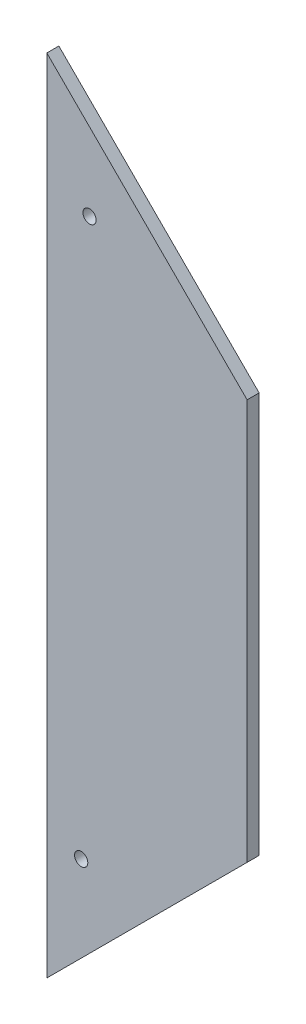
ISO-10303-21;
HEADER;
FILE_DESCRIPTION(('STEP AP214'),'2;1');
FILE_NAME('part.step','',(''),(''),'','','');
FILE_SCHEMA(('AUTOMOTIVE_DESIGN { 1 0 10303 214 1 1 1 1 }'));
ENDSEC;
DATA;
#1=APPLICATION_CONTEXT('core data for automotive mechanical design processes');
#2=APPLICATION_PROTOCOL_DEFINITION('international standard','automotive_design',2000,#1);
#3=PRODUCT_CONTEXT('',#1,'mechanical');
#4=PRODUCT('Part','Part','',(#3));
#5=PRODUCT_RELATED_PRODUCT_CATEGORY('part','',(#4));
#6=PRODUCT_DEFINITION_FORMATION('','',#4);
#7=PRODUCT_DEFINITION_CONTEXT('part definition',#1,'design');
#8=PRODUCT_DEFINITION('design','',#6,#7);
#9=PRODUCT_DEFINITION_SHAPE('','',#8);
#10=(LENGTH_UNIT() NAMED_UNIT(*) SI_UNIT(.MILLI.,.METRE.));
#11=(NAMED_UNIT(*) PLANE_ANGLE_UNIT() SI_UNIT($,.RADIAN.));
#12=(NAMED_UNIT(*) SI_UNIT($,.STERADIAN.) SOLID_ANGLE_UNIT());
#13=UNCERTAINTY_MEASURE_WITH_UNIT(LENGTH_MEASURE(1.E-05),#10,'distance_accuracy_value','');
#14=(GEOMETRIC_REPRESENTATION_CONTEXT(3) GLOBAL_UNCERTAINTY_ASSIGNED_CONTEXT((#13)) GLOBAL_UNIT_ASSIGNED_CONTEXT((#10,
#11,#12)) REPRESENTATION_CONTEXT('',''));
#15=CARTESIAN_POINT('',(0.,0.,0.));
#16=DIRECTION('',(0.,0.,1.));
#17=DIRECTION('',(1.,0.,0.));
#18=AXIS2_PLACEMENT_3D('',#15,#16,#17);
#19=CARTESIAN_POINT('',(0.,0.,3.));
#20=DIRECTION('',(-0.707106781186546,0.707106781186549,0.));
#21=DIRECTION('',(-0.707106781186549,-0.707106781186546,0.));
#22=AXIS2_PLACEMENT_3D('',#19,#20,#21);
#23=PLANE('',#22);
#24=DIRECTION('',(0.707106781186549,0.707106781186546,0.));
#25=VECTOR('',#24,1.);
#26=CARTESIAN_POINT('',(0.,0.,0.));
#27=LINE('',#26,#25);
#28=CARTESIAN_POINT('',(0.,0.,0.));
#29=VERTEX_POINT('',#28);
#30=CARTESIAN_POINT('',(50.,49.9999999999998,0.));
#31=VERTEX_POINT('',#30);
#32=EDGE_CURVE('E105',#29,#31,#27,.T.);
#33=ORIENTED_EDGE('',*,*,#32,.T.);
#34=DIRECTION('',(0.,0.,-1.));
#35=VECTOR('',#34,1.);
#36=CARTESIAN_POINT('',(50.,49.9999999999998,3.));
#37=LINE('',#36,#35);
#38=CARTESIAN_POINT('',(50.,49.9999999999998,3.));
#39=VERTEX_POINT('',#38);
#40=EDGE_CURVE('E11',#39,#31,#37,.T.);
#41=ORIENTED_EDGE('',*,*,#40,.F.);
#42=DIRECTION('',(0.707106781186549,0.707106781186546,0.));
#43=VECTOR('',#42,1.);
#44=CARTESIAN_POINT('',(0.,0.,3.));
#45=LINE('',#44,#43);
#46=CARTESIAN_POINT('',(0.,0.,3.));
#47=VERTEX_POINT('',#46);
#48=EDGE_CURVE('E92',#47,#39,#45,.T.);
#49=ORIENTED_EDGE('',*,*,#48,.F.);
#50=DIRECTION('',(0.,0.,-1.));
#51=VECTOR('',#50,1.);
#52=CARTESIAN_POINT('',(0.,0.,3.));
#53=LINE('',#52,#51);
#54=EDGE_CURVE('E101',#47,#29,#53,.T.);
#55=ORIENTED_EDGE('',*,*,#54,.T.);
#56=EDGE_LOOP('',(#33,#41,#49,#55));
#57=FACE_BOUND('',#56,.T.);
#58=ADVANCED_FACE('F39',(#57),#23,.F.);
#59=CARTESIAN_POINT('',(50.,49.9999999999998,3.));
#60=DIRECTION('',(-1.,0.,0.));
#61=DIRECTION('',(0.,0.,1.));
#62=AXIS2_PLACEMENT_3D('',#59,#60,#61);
#63=PLANE('',#62);
#64=DIRECTION('',(0.,1.,0.));
#65=VECTOR('',#64,1.);
#66=CARTESIAN_POINT('',(50.,49.9999999999998,0.));
#67=LINE('',#66,#65);
#68=CARTESIAN_POINT('',(50.,150.,0.));
#69=VERTEX_POINT('',#68);
#70=EDGE_CURVE('E96',#31,#69,#67,.T.);
#71=ORIENTED_EDGE('',*,*,#70,.T.);
#72=DIRECTION('',(0.,0.,-1.));
#73=VECTOR('',#72,1.);
#74=CARTESIAN_POINT('',(50.,150.,3.));
#75=LINE('',#74,#73);
#76=CARTESIAN_POINT('',(50.,150.,3.));
#77=VERTEX_POINT('',#76);
#78=EDGE_CURVE('E48',#77,#69,#75,.T.);
#79=ORIENTED_EDGE('',*,*,#78,.F.);
#80=DIRECTION('',(0.,1.,0.));
#81=VECTOR('',#80,1.);
#82=CARTESIAN_POINT('',(50.,49.9999999999998,3.));
#83=LINE('',#82,#81);
#84=EDGE_CURVE('E87',#39,#77,#83,.T.);
#85=ORIENTED_EDGE('',*,*,#84,.F.);
#86=ORIENTED_EDGE('',*,*,#40,.T.);
#87=EDGE_LOOP('',(#71,#79,#85,#86));
#88=FACE_BOUND('',#87,.T.);
#89=ADVANCED_FACE('F95',(#88),#63,.F.);
#90=CARTESIAN_POINT('',(50.,150.,3.));
#91=DIRECTION('',(-0.707106781186546,-0.707106781186549,0.));
#92=DIRECTION('',(0.707106781186549,-0.707106781186546,0.));
#93=AXIS2_PLACEMENT_3D('',#90,#91,#92);
#94=PLANE('',#93);
#95=DIRECTION('',(-0.707106781186549,0.707106781186546,0.));
#96=VECTOR('',#95,1.);
#97=CARTESIAN_POINT('',(50.,150.,0.));
#98=LINE('',#97,#96);
#99=CARTESIAN_POINT('',(0.,200.,0.));
#100=VERTEX_POINT('',#99);
#101=EDGE_CURVE('E74',#69,#100,#98,.T.);
#102=ORIENTED_EDGE('',*,*,#101,.T.);
#103=DIRECTION('',(0.,0.,-1.));
#104=VECTOR('',#103,1.);
#105=CARTESIAN_POINT('',(0.,200.,3.));
#106=LINE('',#105,#104);
#107=CARTESIAN_POINT('',(0.,200.,3.));
#108=VERTEX_POINT('',#107);
#109=EDGE_CURVE('E97',#108,#100,#106,.T.);
#110=ORIENTED_EDGE('',*,*,#109,.F.);
#111=DIRECTION('',(-0.707106781186549,0.707106781186546,0.));
#112=VECTOR('',#111,1.);
#113=CARTESIAN_POINT('',(50.,150.,3.));
#114=LINE('',#113,#112);
#115=EDGE_CURVE('E90',#77,#108,#114,.T.);
#116=ORIENTED_EDGE('',*,*,#115,.F.);
#117=ORIENTED_EDGE('',*,*,#78,.T.);
#118=EDGE_LOOP('',(#102,#110,#116,#117));
#119=FACE_BOUND('',#118,.T.);
#120=ADVANCED_FACE('F99',(#119),#94,.F.);
#121=CARTESIAN_POINT('',(0.,0.,3.));
#122=DIRECTION('',(1.,0.,0.));
#123=DIRECTION('',(0.,0.,-1.));
#124=AXIS2_PLACEMENT_3D('',#121,#122,#123);
#125=PLANE('',#124);
#126=DIRECTION('',(0.,-1.,0.));
#127=VECTOR('',#126,1.);
#128=CARTESIAN_POINT('',(0.,0.,0.));
#129=LINE('',#128,#127);
#130=EDGE_CURVE('E80',#100,#29,#129,.T.);
#131=ORIENTED_EDGE('',*,*,#130,.T.);
#132=ORIENTED_EDGE('',*,*,#54,.F.);
#133=DIRECTION('',(0.,-1.,0.));
#134=VECTOR('',#133,1.);
#135=CARTESIAN_POINT('',(0.,0.,3.));
#136=LINE('',#135,#134);
#137=EDGE_CURVE('E57',#108,#47,#136,.T.);
#138=ORIENTED_EDGE('',*,*,#137,.F.);
#139=ORIENTED_EDGE('',*,*,#109,.T.);
#140=EDGE_LOOP('',(#131,#132,#138,#139));
#141=FACE_BOUND('',#140,.T.);
#142=ADVANCED_FACE('F133',(#141),#125,.F.);
#143=CARTESIAN_POINT('',(0.,0.,3.));
#144=DIRECTION('',(0.,0.,1.));
#145=DIRECTION('',(1.,0.,0.));
#146=AXIS2_PLACEMENT_3D('',#143,#144,#145);
#147=PLANE('',#146);
#148=CARTESIAN_POINT('',(10.6552001382833,170.000000000001,3.));
#149=DIRECTION('',(0.,0.,1.));
#150=DIRECTION('',(1.,0.,0.));
#151=AXIS2_PLACEMENT_3D('',#148,#149,#150);
#152=CIRCLE('',#151,1.64999999999994);
#153=CARTESIAN_POINT('',(12.3052001382832,170.000000000001,3.));
#154=VERTEX_POINT('',#153);
#155=EDGE_CURVE('E108',#154,#154,#152,.T.);
#156=ORIENTED_EDGE('',*,*,#155,.F.);
#157=EDGE_LOOP('',(#156));
#158=FACE_BOUND('',#157,.T.);
#159=CARTESIAN_POINT('',(8.57143443026687,30.0155082858326,3.));
#160=DIRECTION('',(0.,0.,1.));
#161=DIRECTION('',(1.,0.,0.));
#162=AXIS2_PLACEMENT_3D('',#159,#160,#161);
#163=CIRCLE('',#162,1.64999999999994);
#164=CARTESIAN_POINT('',(10.2214344302668,30.0155082858326,3.));
#165=VERTEX_POINT('',#164);
#166=EDGE_CURVE('E115',#165,#165,#163,.T.);
#167=ORIENTED_EDGE('',*,*,#166,.F.);
#168=EDGE_LOOP('',(#167));
#169=FACE_BOUND('',#168,.T.);
#170=ORIENTED_EDGE('',*,*,#48,.T.);
#171=ORIENTED_EDGE('',*,*,#84,.T.);
#172=ORIENTED_EDGE('',*,*,#115,.T.);
#173=ORIENTED_EDGE('',*,*,#137,.T.);
#174=EDGE_LOOP('',(#170,#171,#172,#173));
#175=FACE_BOUND('',#174,.T.);
#176=ADVANCED_FACE('F88',(#158,#169,#175),#147,.T.);
#177=CARTESIAN_POINT('',(0.,0.,0.));
#178=DIRECTION('',(0.,0.,1.));
#179=DIRECTION('',(1.,0.,0.));
#180=AXIS2_PLACEMENT_3D('',#177,#178,#179);
#181=PLANE('',#180);
#182=CARTESIAN_POINT('',(10.6552001382833,170.000000000001,0.));
#183=DIRECTION('',(0.,0.,1.));
#184=DIRECTION('',(1.,0.,0.));
#185=AXIS2_PLACEMENT_3D('',#182,#183,#184);
#186=CIRCLE('',#185,1.64999999999994);
#187=CARTESIAN_POINT('',(12.3052001382832,170.000000000001,0.));
#188=VERTEX_POINT('',#187);
#189=EDGE_CURVE('E42',#188,#188,#186,.T.);
#190=ORIENTED_EDGE('',*,*,#189,.T.);
#191=EDGE_LOOP('',(#190));
#192=FACE_BOUND('',#191,.T.);
#193=CARTESIAN_POINT('',(8.57143443026687,30.0155082858326,0.));
#194=DIRECTION('',(0.,0.,1.));
#195=DIRECTION('',(1.,0.,0.));
#196=AXIS2_PLACEMENT_3D('',#193,#194,#195);
#197=CIRCLE('',#196,1.64999999999994);
#198=CARTESIAN_POINT('',(10.2214344302668,30.0155082858326,0.));
#199=VERTEX_POINT('',#198);
#200=EDGE_CURVE('E113',#199,#199,#197,.T.);
#201=ORIENTED_EDGE('',*,*,#200,.T.);
#202=EDGE_LOOP('',(#201));
#203=FACE_BOUND('',#202,.T.);
#204=ORIENTED_EDGE('',*,*,#32,.F.);
#205=ORIENTED_EDGE('',*,*,#130,.F.);
#206=ORIENTED_EDGE('',*,*,#101,.F.);
#207=ORIENTED_EDGE('',*,*,#70,.F.);
#208=EDGE_LOOP('',(#204,#205,#206,#207));
#209=FACE_BOUND('',#208,.T.);
#210=ADVANCED_FACE('F132',(#192,#203,#209),#181,.F.);
#211=CARTESIAN_POINT('',(8.57143443026687,30.0155082858326,6.49999999999176));
#212=DIRECTION('',(0.,0.,-1.));
#213=DIRECTION('',(0.,1.,0.));
#214=AXIS2_PLACEMENT_3D('',#211,#212,#213);
#215=CYLINDRICAL_SURFACE('',#214,1.64999999999994);
#216=ORIENTED_EDGE('',*,*,#166,.T.);
#217=EDGE_LOOP('',(#216));
#218=FACE_BOUND('',#217,.T.);
#219=ORIENTED_EDGE('',*,*,#200,.F.);
#220=EDGE_LOOP('',(#219));
#221=FACE_BOUND('',#220,.T.);
#222=ADVANCED_FACE('F139',(#218,#221),#215,.F.);
#223=CARTESIAN_POINT('',(10.6552001382833,170.000000000001,6.49999999999178));
#224=DIRECTION('',(0.,0.,-1.));
#225=DIRECTION('',(0.,1.,0.));
#226=AXIS2_PLACEMENT_3D('',#223,#224,#225);
#227=CYLINDRICAL_SURFACE('',#226,1.64999999999994);
#228=ORIENTED_EDGE('',*,*,#155,.T.);
#229=EDGE_LOOP('',(#228));
#230=FACE_BOUND('',#229,.T.);
#231=ORIENTED_EDGE('',*,*,#189,.F.);
#232=EDGE_LOOP('',(#231));
#233=FACE_BOUND('',#232,.T.);
#234=ADVANCED_FACE('F127',(#230,#233),#227,.F.);
#235=CLOSED_SHELL('',(#58,#89,#120,#142,#176,#210,#222,#234));
#236=MANIFOLD_SOLID_BREP('B2',#235);
#237=ADVANCED_BREP_SHAPE_REPRESENTATION('',(#18,#236),#14);
#238=SHAPE_DEFINITION_REPRESENTATION(#9,#237);
ENDSEC;
END-ISO-10303-21;
